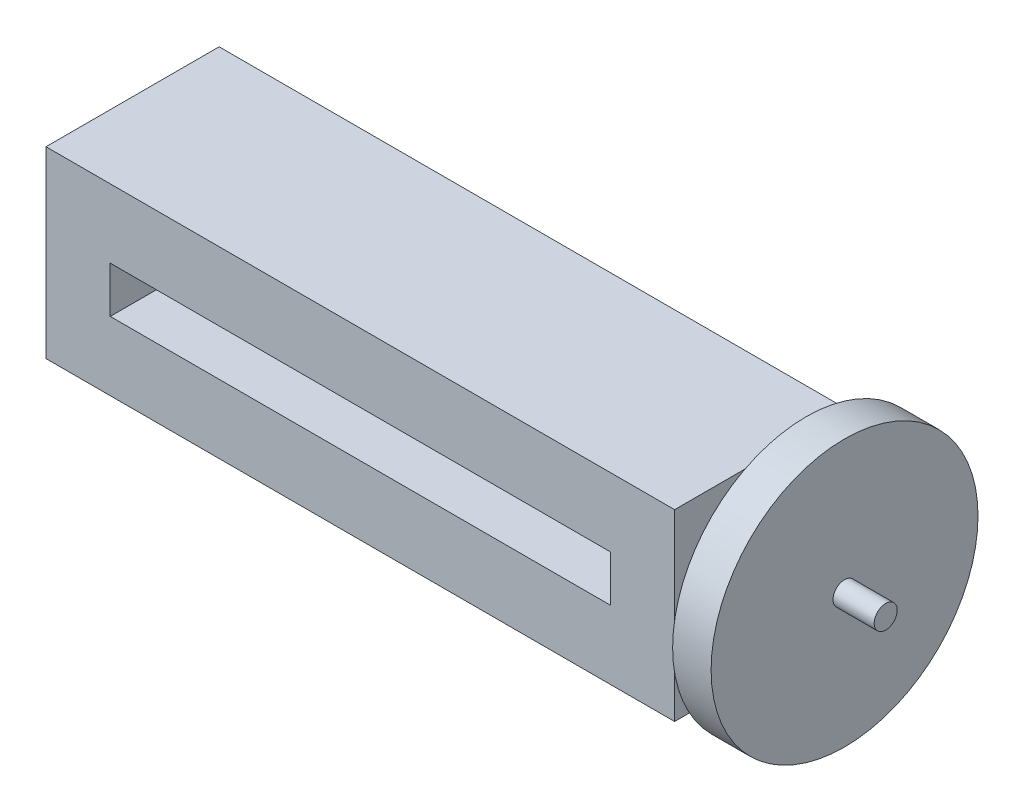
ISO-10303-21;
HEADER;
FILE_DESCRIPTION(('STEP AP214'),'2;1');
FILE_NAME('part.step','',(''),(''),'','','');
FILE_SCHEMA(('AUTOMOTIVE_DESIGN { 1 0 10303 214 1 1 1 1 }'));
ENDSEC;
DATA;
#1=APPLICATION_CONTEXT('core data for automotive mechanical design processes');
#2=APPLICATION_PROTOCOL_DEFINITION('international standard','automotive_design',2000,#1);
#3=PRODUCT_CONTEXT('',#1,'mechanical');
#4=PRODUCT('Part','Part','',(#3));
#5=PRODUCT_RELATED_PRODUCT_CATEGORY('part','',(#4));
#6=PRODUCT_DEFINITION_FORMATION('','',#4);
#7=PRODUCT_DEFINITION_CONTEXT('part definition',#1,'design');
#8=PRODUCT_DEFINITION('design','',#6,#7);
#9=PRODUCT_DEFINITION_SHAPE('','',#8);
#10=(LENGTH_UNIT() NAMED_UNIT(*) SI_UNIT(.MILLI.,.METRE.));
#11=(NAMED_UNIT(*) PLANE_ANGLE_UNIT() SI_UNIT($,.RADIAN.));
#12=(NAMED_UNIT(*) SI_UNIT($,.STERADIAN.) SOLID_ANGLE_UNIT());
#13=UNCERTAINTY_MEASURE_WITH_UNIT(LENGTH_MEASURE(1.E-05),#10,'distance_accuracy_value','');
#14=(GEOMETRIC_REPRESENTATION_CONTEXT(3) GLOBAL_UNCERTAINTY_ASSIGNED_CONTEXT((#13)) GLOBAL_UNIT_ASSIGNED_CONTEXT((#10,
#11,#12)) REPRESENTATION_CONTEXT('',''));
#15=CARTESIAN_POINT('',(0.,0.,0.));
#16=DIRECTION('',(0.,0.,1.));
#17=DIRECTION('',(1.,0.,0.));
#18=AXIS2_PLACEMENT_3D('',#15,#16,#17);
#19=CARTESIAN_POINT('',(-3.73,-9.68944444444445,3.36241386109098));
#20=DIRECTION('',(1.,0.,0.));
#21=DIRECTION('',(0.,1.,0.));
#22=AXIS2_PLACEMENT_3D('',#19,#20,#21);
#23=PLANE('',#22);
#24=CARTESIAN_POINT('',(-3.73,-9.68944444444444,3.36241386109098));
#25=DIRECTION('',(1.,0.,0.));
#26=DIRECTION('',(0.,1.,0.));
#27=AXIS2_PLACEMENT_3D('',#24,#25,#26);
#28=CIRCLE('',#27,0.3);
#29=CARTESIAN_POINT('',(-3.73,-9.38944444444444,3.36241386109098));
#30=VERTEX_POINT('',#29);
#31=EDGE_CURVE('E20',#30,#30,#28,.F.);
#32=ORIENTED_EDGE('',*,*,#31,.F.);
#33=EDGE_LOOP('',(#32));
#34=FACE_BOUND('',#33,.T.);
#35=ADVANCED_FACE('F17',(#34),#23,.T.);
#36=CARTESIAN_POINT('',(-22.84,-9.68944444444445,3.36241386109098));
#37=DIRECTION('',(1.,0.,0.));
#38=DIRECTION('',(0.,1.,0.));
#39=AXIS2_PLACEMENT_3D('',#36,#37,#38);
#40=CYLINDRICAL_SURFACE('',#39,0.3);
#41=ORIENTED_EDGE('',*,*,#31,.T.);
#42=EDGE_LOOP('',(#41));
#43=FACE_BOUND('',#42,.T.);
#44=CARTESIAN_POINT('',(-4.8,-9.68944444444444,3.36241386109098));
#45=DIRECTION('',(1.,0.,0.));
#46=DIRECTION('',(0.,1.,0.));
#47=AXIS2_PLACEMENT_3D('',#44,#45,#46);
#48=CIRCLE('',#47,0.3);
#49=CARTESIAN_POINT('',(-4.8,-9.38944444444444,3.36241386109098));
#50=VERTEX_POINT('',#49);
#51=EDGE_CURVE('E176',#50,#50,#48,.F.);
#52=ORIENTED_EDGE('',*,*,#51,.F.);
#53=EDGE_LOOP('',(#52));
#54=FACE_BOUND('',#53,.T.);
#55=ADVANCED_FACE('F183',(#43,#54),#40,.T.);
#56=CARTESIAN_POINT('',(-4.8,-9.68944444444445,3.36241386109098));
#57=DIRECTION('',(1.,0.,0.));
#58=DIRECTION('',(0.,1.,0.));
#59=AXIS2_PLACEMENT_3D('',#56,#57,#58);
#60=PLANE('',#59);
#61=CARTESIAN_POINT('',(-4.8,-9.68944444444445,3.36241386109098));
#62=DIRECTION('',(1.,0.,0.));
#63=DIRECTION('',(0.,1.,0.));
#64=AXIS2_PLACEMENT_3D('',#61,#62,#63);
#65=CIRCLE('',#64,3.46896088612476);
#66=CARTESIAN_POINT('',(-4.8,-6.22048355831969,3.36241386109098));
#67=VERTEX_POINT('',#66);
#68=EDGE_CURVE('E114',#67,#67,#65,.F.);
#69=ORIENTED_EDGE('',*,*,#68,.F.);
#70=EDGE_LOOP('',(#69));
#71=FACE_BOUND('',#70,.T.);
#72=ORIENTED_EDGE('',*,*,#51,.T.);
#73=EDGE_LOOP('',(#72));
#74=FACE_BOUND('',#73,.T.);
#75=ADVANCED_FACE('F191',(#71,#74),#60,.T.);
#76=CARTESIAN_POINT('',(-22.84,-9.68944444444445,3.36241386109098));
#77=DIRECTION('',(1.,0.,0.));
#78=DIRECTION('',(0.,1.,0.));
#79=AXIS2_PLACEMENT_3D('',#76,#77,#78);
#80=CYLINDRICAL_SURFACE('',#79,0.3);
#81=DIRECTION('',(1.,0.,0.));
#82=VECTOR('',#81,1.);
#83=CARTESIAN_POINT('',(-14.67,-9.98334403037525,3.30222222222222));
#84=LINE('',#83,#82);
#85=CARTESIAN_POINT('',(-21.17,-9.98334403037525,3.30222222222222));
#86=VERTEX_POINT('',#85);
#87=CARTESIAN_POINT('',(-8.17,-9.98334403037525,3.30222222222222));
#88=VERTEX_POINT('',#87);
#89=EDGE_CURVE('E100',#86,#88,#84,.T.);
#90=ORIENTED_EDGE('',*,*,#89,.T.);
#91=CARTESIAN_POINT('',(-8.17,-9.68944444444445,3.36241386109098));
#92=DIRECTION('',(1.,0.,0.));
#93=DIRECTION('',(0.,1.,0.));
#94=AXIS2_PLACEMENT_3D('',#91,#92,#93);
#95=CIRCLE('',#94,0.3);
#96=CARTESIAN_POINT('',(-8.17,-9.39554485851365,3.30222222222222));
#97=VERTEX_POINT('',#96);
#98=EDGE_CURVE('E94',#88,#97,#95,.F.);
#99=ORIENTED_EDGE('',*,*,#98,.T.);
#100=DIRECTION('',(1.,0.,0.));
#101=VECTOR('',#100,1.);
#102=CARTESIAN_POINT('',(-14.67,-9.39554485851365,3.30222222222222));
#103=LINE('',#102,#101);
#104=CARTESIAN_POINT('',(-21.17,-9.39554485851365,3.30222222222221));
#105=VERTEX_POINT('',#104);
#106=EDGE_CURVE('E97',#97,#105,#103,.F.);
#107=ORIENTED_EDGE('',*,*,#106,.T.);
#108=CARTESIAN_POINT('',(-21.17,-9.68944444444445,3.36241386109098));
#109=DIRECTION('',(1.,0.,0.));
#110=DIRECTION('',(0.,1.,0.));
#111=AXIS2_PLACEMENT_3D('',#108,#109,#110);
#112=CIRCLE('',#111,0.3);
#113=EDGE_CURVE('E89',#105,#86,#112,.T.);
#114=ORIENTED_EDGE('',*,*,#113,.T.);
#115=EDGE_LOOP('',(#90,#99,#107,#114));
#116=FACE_BOUND('',#115,.T.);
#117=ADVANCED_FACE('F96',(#116),#80,.T.);
#118=CARTESIAN_POINT('',(-5.8,-9.68944444444445,3.36241386109098));
#119=DIRECTION('',(1.,0.,0.));
#120=DIRECTION('',(0.,1.,0.));
#121=AXIS2_PLACEMENT_3D('',#118,#119,#120);
#122=CYLINDRICAL_SURFACE('',#121,3.46896088612476);
#123=CARTESIAN_POINT('',(-5.8,-9.68944444444445,3.36241386109098));
#124=DIRECTION('',(1.,0.,0.));
#125=DIRECTION('',(0.,1.,0.));
#126=AXIS2_PLACEMENT_3D('',#123,#124,#125);
#127=CIRCLE('',#126,3.46896088612476);
#128=CARTESIAN_POINT('',(-5.8,-6.22048355831969,3.36241386109098));
#129=VERTEX_POINT('',#128);
#130=EDGE_CURVE('E127',#129,#129,#127,.T.);
#131=ORIENTED_EDGE('',*,*,#130,.T.);
#132=EDGE_LOOP('',(#131));
#133=FACE_BOUND('',#132,.T.);
#134=ORIENTED_EDGE('',*,*,#68,.T.);
#135=EDGE_LOOP('',(#134));
#136=FACE_BOUND('',#135,.T.);
#137=ADVANCED_FACE('F246',(#133,#136),#122,.T.);
#138=CARTESIAN_POINT('',(-14.67,-9.68944444444446,3.30222222222222));
#139=DIRECTION('',(0.,0.,-1.));
#140=DIRECTION('',(0.,1.,0.));
#141=AXIS2_PLACEMENT_3D('',#138,#139,#140);
#142=PLANE('',#141);
#143=DIRECTION('',(0.,1.,0.));
#144=VECTOR('',#143,1.);
#145=CARTESIAN_POINT('',(-8.17,-9.68944444444445,3.30222222222222));
#146=LINE('',#145,#144);
#147=CARTESIAN_POINT('',(-8.17,-9.08944444444446,3.30222222222222));
#148=VERTEX_POINT('',#147);
#149=EDGE_CURVE('E111',#97,#148,#146,.T.);
#150=ORIENTED_EDGE('',*,*,#149,.T.);
#151=DIRECTION('',(1.,0.,0.));
#152=VECTOR('',#151,1.);
#153=CARTESIAN_POINT('',(-14.67,-9.08944444444446,3.30222222222221));
#154=LINE('',#153,#152);
#155=CARTESIAN_POINT('',(-21.17,-9.08944444444445,3.30222222222221));
#156=VERTEX_POINT('',#155);
#157=EDGE_CURVE('E150',#148,#156,#154,.F.);
#158=ORIENTED_EDGE('',*,*,#157,.T.);
#159=DIRECTION('',(0.,1.,0.));
#160=VECTOR('',#159,1.);
#161=CARTESIAN_POINT('',(-21.17,-9.68944444444445,3.30222222222221));
#162=LINE('',#161,#160);
#163=EDGE_CURVE('E113',#156,#105,#162,.F.);
#164=ORIENTED_EDGE('',*,*,#163,.T.);
#165=ORIENTED_EDGE('',*,*,#106,.F.);
#166=EDGE_LOOP('',(#150,#158,#164,#165));
#167=FACE_BOUND('',#166,.T.);
#168=ADVANCED_FACE('F109',(#167),#142,.F.);
#169=CARTESIAN_POINT('',(-8.17,-9.68944444444445,6.07999999999999));
#170=DIRECTION('',(1.,0.,0.));
#171=DIRECTION('',(0.,0.,-1.));
#172=AXIS2_PLACEMENT_3D('',#169,#170,#171);
#173=PLANE('',#172);
#174=ORIENTED_EDGE('',*,*,#149,.F.);
#175=ORIENTED_EDGE('',*,*,#98,.F.);
#176=DIRECTION('',(0.,1.,0.));
#177=VECTOR('',#176,1.);
#178=CARTESIAN_POINT('',(-8.17,-9.68944444444446,3.30222222222222));
#179=LINE('',#178,#177);
#180=CARTESIAN_POINT('',(-8.17,-10.2894444444444,3.30222222222222));
#181=VERTEX_POINT('',#180);
#182=EDGE_CURVE('E130',#88,#181,#179,.F.);
#183=ORIENTED_EDGE('',*,*,#182,.T.);
#184=DIRECTION('',(0.,0.,-1.));
#185=VECTOR('',#184,1.);
#186=CARTESIAN_POINT('',(-8.17,-10.2894444444444,6.08));
#187=LINE('',#186,#185);
#188=CARTESIAN_POINT('',(-8.17,-10.2894444444444,6.07999999999999));
#189=VERTEX_POINT('',#188);
#190=EDGE_CURVE('E142',#181,#189,#187,.F.);
#191=ORIENTED_EDGE('',*,*,#190,.T.);
#192=DIRECTION('',(0.,1.,0.));
#193=VECTOR('',#192,1.);
#194=CARTESIAN_POINT('',(-8.17,-9.68944444444445,6.07999999999999));
#195=LINE('',#194,#193);
#196=CARTESIAN_POINT('',(-8.17,-9.08944444444445,6.07999999999999));
#197=VERTEX_POINT('',#196);
#198=EDGE_CURVE('E106',#197,#189,#195,.F.);
#199=ORIENTED_EDGE('',*,*,#198,.F.);
#200=DIRECTION('',(0.,0.,1.));
#201=VECTOR('',#200,1.);
#202=CARTESIAN_POINT('',(-8.17,-9.08944444444445,6.07999999999999));
#203=LINE('',#202,#201);
#204=EDGE_CURVE('E119',#197,#148,#203,.F.);
#205=ORIENTED_EDGE('',*,*,#204,.T.);
#206=EDGE_LOOP('',(#174,#175,#183,#191,#199,#205));
#207=FACE_BOUND('',#206,.T.);
#208=ADVANCED_FACE('F117',(#207),#173,.F.);
#209=CARTESIAN_POINT('',(-21.17,-9.68944444444445,6.07999999999999));
#210=DIRECTION('',(-1.,0.,0.));
#211=DIRECTION('',(0.,0.,1.));
#212=AXIS2_PLACEMENT_3D('',#209,#210,#211);
#213=PLANE('',#212);
#214=ORIENTED_EDGE('',*,*,#113,.F.);
#215=ORIENTED_EDGE('',*,*,#163,.F.);
#216=DIRECTION('',(0.,0.,1.));
#217=VECTOR('',#216,1.);
#218=CARTESIAN_POINT('',(-21.17,-9.08944444444445,6.07999999999999));
#219=LINE('',#218,#217);
#220=CARTESIAN_POINT('',(-21.17,-9.08944444444445,6.08));
#221=VERTEX_POINT('',#220);
#222=EDGE_CURVE('E153',#156,#221,#219,.T.);
#223=ORIENTED_EDGE('',*,*,#222,.T.);
#224=DIRECTION('',(0.,1.,0.));
#225=VECTOR('',#224,1.);
#226=CARTESIAN_POINT('',(-21.17,-9.68944444444445,6.08));
#227=LINE('',#226,#225);
#228=CARTESIAN_POINT('',(-21.17,-10.2894444444445,6.08));
#229=VERTEX_POINT('',#228);
#230=EDGE_CURVE('E105',#229,#221,#227,.T.);
#231=ORIENTED_EDGE('',*,*,#230,.F.);
#232=DIRECTION('',(0.,0.,-1.));
#233=VECTOR('',#232,1.);
#234=CARTESIAN_POINT('',(-21.17,-10.2894444444444,6.08));
#235=LINE('',#234,#233);
#236=CARTESIAN_POINT('',(-21.17,-10.2894444444445,3.30222222222222));
#237=VERTEX_POINT('',#236);
#238=EDGE_CURVE('E137',#229,#237,#235,.T.);
#239=ORIENTED_EDGE('',*,*,#238,.T.);
#240=DIRECTION('',(0.,1.,0.));
#241=VECTOR('',#240,1.);
#242=CARTESIAN_POINT('',(-21.17,-9.68944444444446,3.30222222222222));
#243=LINE('',#242,#241);
#244=EDGE_CURVE('E128',#237,#86,#243,.T.);
#245=ORIENTED_EDGE('',*,*,#244,.T.);
#246=EDGE_LOOP('',(#214,#215,#223,#231,#239,#245));
#247=FACE_BOUND('',#246,.T.);
#248=ADVANCED_FACE('F238',(#247),#213,.F.);
#249=CARTESIAN_POINT('',(-14.67,-9.68944444444446,3.30222222222222));
#250=DIRECTION('',(0.,0.,-1.));
#251=DIRECTION('',(0.,1.,0.));
#252=AXIS2_PLACEMENT_3D('',#249,#250,#251);
#253=PLANE('',#252);
#254=ORIENTED_EDGE('',*,*,#244,.F.);
#255=DIRECTION('',(1.,0.,0.));
#256=VECTOR('',#255,1.);
#257=CARTESIAN_POINT('',(-14.67,-10.2894444444444,3.30222222222222));
#258=LINE('',#257,#256);
#259=EDGE_CURVE('E133',#237,#181,#258,.T.);
#260=ORIENTED_EDGE('',*,*,#259,.T.);
#261=ORIENTED_EDGE('',*,*,#182,.F.);
#262=ORIENTED_EDGE('',*,*,#89,.F.);
#263=EDGE_LOOP('',(#254,#260,#261,#262));
#264=FACE_BOUND('',#263,.T.);
#265=ADVANCED_FACE('F234',(#264),#253,.F.);
#266=CARTESIAN_POINT('',(-5.8,-9.68944444444445,3.36241386109098));
#267=DIRECTION('',(1.,0.,0.));
#268=DIRECTION('',(0.,1.,0.));
#269=AXIS2_PLACEMENT_3D('',#266,#267,#268);
#270=PLANE('',#269);
#271=ORIENTED_EDGE('',*,*,#130,.F.);
#272=EDGE_LOOP('',(#271));
#273=FACE_BOUND('',#272,.T.);
#274=CARTESIAN_POINT('',(-5.8,-9.68944444444444,3.36241386109098));
#275=DIRECTION('',(1.,0.,0.));
#276=DIRECTION('',(0.,1.,0.));
#277=AXIS2_PLACEMENT_3D('',#274,#275,#276);
#278=CIRCLE('',#277,0.3);
#279=CARTESIAN_POINT('',(-5.8,-9.38944444444444,3.36241386109098));
#280=VERTEX_POINT('',#279);
#281=EDGE_CURVE('E136',#280,#280,#278,.F.);
#282=ORIENTED_EDGE('',*,*,#281,.F.);
#283=EDGE_LOOP('',(#282));
#284=FACE_BOUND('',#283,.T.);
#285=ADVANCED_FACE('F230',(#273,#284),#270,.F.);
#286=CARTESIAN_POINT('',(-14.67,-9.08944444444445,6.07999999999999));
#287=DIRECTION('',(0.,1.,0.));
#288=DIRECTION('',(0.,0.,1.));
#289=AXIS2_PLACEMENT_3D('',#286,#287,#288);
#290=PLANE('',#289);
#291=ORIENTED_EDGE('',*,*,#204,.F.);
#292=DIRECTION('',(1.,0.,0.));
#293=VECTOR('',#292,1.);
#294=CARTESIAN_POINT('',(-14.67,-9.08944444444445,6.08));
#295=LINE('',#294,#293);
#296=EDGE_CURVE('E171',#221,#197,#295,.T.);
#297=ORIENTED_EDGE('',*,*,#296,.F.);
#298=ORIENTED_EDGE('',*,*,#222,.F.);
#299=ORIENTED_EDGE('',*,*,#157,.F.);
#300=EDGE_LOOP('',(#291,#297,#298,#299));
#301=FACE_BOUND('',#300,.T.);
#302=ADVANCED_FACE('F226',(#301),#290,.F.);
#303=CARTESIAN_POINT('',(-14.67,-10.2894444444444,6.08));
#304=DIRECTION('',(0.,-1.,0.));
#305=DIRECTION('',(0.,0.,-1.));
#306=AXIS2_PLACEMENT_3D('',#303,#304,#305);
#307=PLANE('',#306);
#308=ORIENTED_EDGE('',*,*,#238,.F.);
#309=DIRECTION('',(1.,0.,0.));
#310=VECTOR('',#309,1.);
#311=CARTESIAN_POINT('',(-14.67,-10.2894444444444,6.08));
#312=LINE('',#311,#310);
#313=EDGE_CURVE('E168',#189,#229,#312,.F.);
#314=ORIENTED_EDGE('',*,*,#313,.F.);
#315=ORIENTED_EDGE('',*,*,#190,.F.);
#316=ORIENTED_EDGE('',*,*,#259,.F.);
#317=EDGE_LOOP('',(#308,#314,#315,#316));
#318=FACE_BOUND('',#317,.T.);
#319=ADVANCED_FACE('F222',(#318),#307,.F.);
#320=CARTESIAN_POINT('',(-22.84,-9.68944444444445,3.36241386109098));
#321=DIRECTION('',(1.,0.,0.));
#322=DIRECTION('',(0.,1.,0.));
#323=AXIS2_PLACEMENT_3D('',#320,#321,#322);
#324=CYLINDRICAL_SURFACE('',#323,0.3);
#325=ORIENTED_EDGE('',*,*,#281,.T.);
#326=EDGE_LOOP('',(#325));
#327=FACE_BOUND('',#326,.T.);
#328=CARTESIAN_POINT('',(-6.5,-9.68944444444444,3.36241386109098));
#329=DIRECTION('',(1.,0.,0.));
#330=DIRECTION('',(0.,1.,0.));
#331=AXIS2_PLACEMENT_3D('',#328,#329,#330);
#332=CIRCLE('',#331,0.3);
#333=CARTESIAN_POINT('',(-6.5,-9.38944444444444,3.36241386109098));
#334=VERTEX_POINT('',#333);
#335=EDGE_CURVE('E164',#334,#334,#332,.F.);
#336=ORIENTED_EDGE('',*,*,#335,.F.);
#337=EDGE_LOOP('',(#336));
#338=FACE_BOUND('',#337,.T.);
#339=ADVANCED_FACE('F218',(#327,#338),#324,.T.);
#340=CARTESIAN_POINT('',(-14.67,-9.68944444444445,6.08));
#341=DIRECTION('',(0.,0.,1.));
#342=DIRECTION('',(1.,0.,0.));
#343=AXIS2_PLACEMENT_3D('',#340,#341,#342);
#344=PLANE('',#343);
#345=DIRECTION('',(0.,1.,0.));
#346=VECTOR('',#345,1.);
#347=CARTESIAN_POINT('',(-6.5,-9.68944444444445,6.08));
#348=LINE('',#347,#346);
#349=CARTESIAN_POINT('',(-6.5,-7.30444444444445,6.08));
#350=VERTEX_POINT('',#349);
#351=CARTESIAN_POINT('',(-6.5,-12.0744444444444,6.08));
#352=VERTEX_POINT('',#351);
#353=EDGE_CURVE('E167',#350,#352,#348,.F.);
#354=ORIENTED_EDGE('',*,*,#353,.F.);
#355=DIRECTION('',(1.,0.,0.));
#356=VECTOR('',#355,1.);
#357=CARTESIAN_POINT('',(-14.67,-7.30444444444445,6.08));
#358=LINE('',#357,#356);
#359=CARTESIAN_POINT('',(-22.84,-7.30444444444445,6.08));
#360=VERTEX_POINT('',#359);
#361=EDGE_CURVE('E394',#360,#350,#358,.T.);
#362=ORIENTED_EDGE('',*,*,#361,.F.);
#363=DIRECTION('',(0.,1.,0.));
#364=VECTOR('',#363,1.);
#365=CARTESIAN_POINT('',(-22.84,-9.68944444444445,6.08));
#366=LINE('',#365,#364);
#367=CARTESIAN_POINT('',(-22.84,-12.0744444444444,6.08));
#368=VERTEX_POINT('',#367);
#369=EDGE_CURVE('E398',#368,#360,#366,.T.);
#370=ORIENTED_EDGE('',*,*,#369,.F.);
#371=DIRECTION('',(1.,0.,0.));
#372=VECTOR('',#371,1.);
#373=CARTESIAN_POINT('',(-14.67,-12.0744444444444,6.08));
#374=LINE('',#373,#372);
#375=EDGE_CURVE('E402',#352,#368,#374,.F.);
#376=ORIENTED_EDGE('',*,*,#375,.F.);
#377=EDGE_LOOP('',(#354,#362,#370,#376));
#378=FACE_BOUND('',#377,.T.);
#379=ORIENTED_EDGE('',*,*,#198,.T.);
#380=ORIENTED_EDGE('',*,*,#313,.T.);
#381=ORIENTED_EDGE('',*,*,#230,.T.);
#382=ORIENTED_EDGE('',*,*,#296,.T.);
#383=EDGE_LOOP('',(#379,#380,#381,#382));
#384=FACE_BOUND('',#383,.T.);
#385=ADVANCED_FACE('F214',(#378,#384),#344,.T.);
#386=CARTESIAN_POINT('',(-6.5,-9.68944444444445,1.58));
#387=DIRECTION('',(1.,0.,0.));
#388=DIRECTION('',(0.,0.,-1.));
#389=AXIS2_PLACEMENT_3D('',#386,#387,#388);
#390=PLANE('',#389);
#391=DIRECTION('',(0.,1.,0.));
#392=VECTOR('',#391,1.);
#393=CARTESIAN_POINT('',(-6.5,-9.68944444444445,1.58));
#394=LINE('',#393,#392);
#395=CARTESIAN_POINT('',(-6.5,-12.0744444444444,1.58));
#396=VERTEX_POINT('',#395);
#397=CARTESIAN_POINT('',(-6.5,-7.30444444444445,1.58));
#398=VERTEX_POINT('',#397);
#399=EDGE_CURVE('E408',#396,#398,#394,.T.);
#400=ORIENTED_EDGE('',*,*,#399,.T.);
#401=DIRECTION('',(0.,0.,1.));
#402=VECTOR('',#401,1.);
#403=CARTESIAN_POINT('',(-6.5,-7.30444444444445,1.58));
#404=LINE('',#403,#402);
#405=EDGE_CURVE('E396',#350,#398,#404,.F.);
#406=ORIENTED_EDGE('',*,*,#405,.F.);
#407=ORIENTED_EDGE('',*,*,#353,.T.);
#408=DIRECTION('',(0.,0.,-1.));
#409=VECTOR('',#408,1.);
#410=CARTESIAN_POINT('',(-6.5,-12.0744444444444,1.58));
#411=LINE('',#410,#409);
#412=EDGE_CURVE('E405',#396,#352,#411,.F.);
#413=ORIENTED_EDGE('',*,*,#412,.F.);
#414=EDGE_LOOP('',(#400,#406,#407,#413));
#415=FACE_BOUND('',#414,.T.);
#416=ORIENTED_EDGE('',*,*,#335,.T.);
#417=EDGE_LOOP('',(#416));
#418=FACE_BOUND('',#417,.T.);
#419=ADVANCED_FACE('F210',(#415,#418),#390,.T.);
#420=CARTESIAN_POINT('',(-14.67,-7.30444444444445,1.58));
#421=DIRECTION('',(0.,1.,0.));
#422=DIRECTION('',(0.,0.,1.));
#423=AXIS2_PLACEMENT_3D('',#420,#421,#422);
#424=PLANE('',#423);
#425=DIRECTION('',(1.,0.,0.));
#426=VECTOR('',#425,1.);
#427=CARTESIAN_POINT('',(-14.67,-7.30444444444445,1.58));
#428=LINE('',#427,#426);
#429=CARTESIAN_POINT('',(-22.84,-7.30444444444445,1.58));
#430=VERTEX_POINT('',#429);
#431=EDGE_CURVE('E411',#398,#430,#428,.F.);
#432=ORIENTED_EDGE('',*,*,#431,.T.);
#433=DIRECTION('',(0.,0.,1.));
#434=VECTOR('',#433,1.);
#435=CARTESIAN_POINT('',(-22.84,-7.30444444444445,1.58));
#436=LINE('',#435,#434);
#437=EDGE_CURVE('E400',#360,#430,#436,.F.);
#438=ORIENTED_EDGE('',*,*,#437,.F.);
#439=ORIENTED_EDGE('',*,*,#361,.T.);
#440=ORIENTED_EDGE('',*,*,#405,.T.);
#441=EDGE_LOOP('',(#432,#438,#439,#440));
#442=FACE_BOUND('',#441,.T.);
#443=ADVANCED_FACE('F206',(#442),#424,.T.);
#444=CARTESIAN_POINT('',(-22.84,-9.68944444444445,1.58));
#445=DIRECTION('',(-1.,0.,0.));
#446=DIRECTION('',(0.,0.,1.));
#447=AXIS2_PLACEMENT_3D('',#444,#445,#446);
#448=PLANE('',#447);
#449=DIRECTION('',(0.,1.,0.));
#450=VECTOR('',#449,1.);
#451=CARTESIAN_POINT('',(-22.84,-9.68944444444445,1.58));
#452=LINE('',#451,#450);
#453=CARTESIAN_POINT('',(-22.84,-12.0744444444444,1.58));
#454=VERTEX_POINT('',#453);
#455=EDGE_CURVE('E26',#430,#454,#452,.F.);
#456=ORIENTED_EDGE('',*,*,#455,.T.);
#457=DIRECTION('',(0.,0.,-1.));
#458=VECTOR('',#457,1.);
#459=CARTESIAN_POINT('',(-22.84,-12.0744444444444,1.58));
#460=LINE('',#459,#458);
#461=EDGE_CURVE('E34',#368,#454,#460,.T.);
#462=ORIENTED_EDGE('',*,*,#461,.F.);
#463=ORIENTED_EDGE('',*,*,#369,.T.);
#464=ORIENTED_EDGE('',*,*,#437,.T.);
#465=EDGE_LOOP('',(#456,#462,#463,#464));
#466=FACE_BOUND('',#465,.T.);
#467=ADVANCED_FACE('F200',(#466),#448,.T.);
#468=CARTESIAN_POINT('',(-14.67,-12.0744444444444,1.58));
#469=DIRECTION('',(0.,-1.,0.));
#470=DIRECTION('',(0.,0.,-1.));
#471=AXIS2_PLACEMENT_3D('',#468,#469,#470);
#472=PLANE('',#471);
#473=DIRECTION('',(1.,0.,0.));
#474=VECTOR('',#473,1.);
#475=CARTESIAN_POINT('',(-14.67,-12.0744444444444,1.58));
#476=LINE('',#475,#474);
#477=EDGE_CURVE('E11',#454,#396,#476,.T.);
#478=ORIENTED_EDGE('',*,*,#477,.T.);
#479=ORIENTED_EDGE('',*,*,#412,.T.);
#480=ORIENTED_EDGE('',*,*,#375,.T.);
#481=ORIENTED_EDGE('',*,*,#461,.T.);
#482=EDGE_LOOP('',(#478,#479,#480,#481));
#483=FACE_BOUND('',#482,.T.);
#484=ADVANCED_FACE('F194',(#483),#472,.T.);
#485=CARTESIAN_POINT('',(-14.67,-9.68944444444445,1.58));
#486=DIRECTION('',(0.,0.,1.));
#487=DIRECTION('',(1.,0.,0.));
#488=AXIS2_PLACEMENT_3D('',#485,#486,#487);
#489=PLANE('',#488);
#490=ORIENTED_EDGE('',*,*,#455,.F.);
#491=ORIENTED_EDGE('',*,*,#431,.F.);
#492=ORIENTED_EDGE('',*,*,#399,.F.);
#493=ORIENTED_EDGE('',*,*,#477,.F.);
#494=EDGE_LOOP('',(#490,#491,#492,#493));
#495=FACE_BOUND('',#494,.T.);
#496=ADVANCED_FACE('F192',(#495),#489,.F.);
#497=CLOSED_SHELL('',(#35,#55,#75,#117,#137,#168,#208,#248,#265,#285,#302,#319,#339,#385,#419,
#443,#467,#484,#496));
#498=MANIFOLD_SOLID_BREP('B1',#497);
#499=ADVANCED_BREP_SHAPE_REPRESENTATION('',(#18,#498),#14);
#500=SHAPE_DEFINITION_REPRESENTATION(#9,#499);
ENDSEC;
END-ISO-10303-21;
